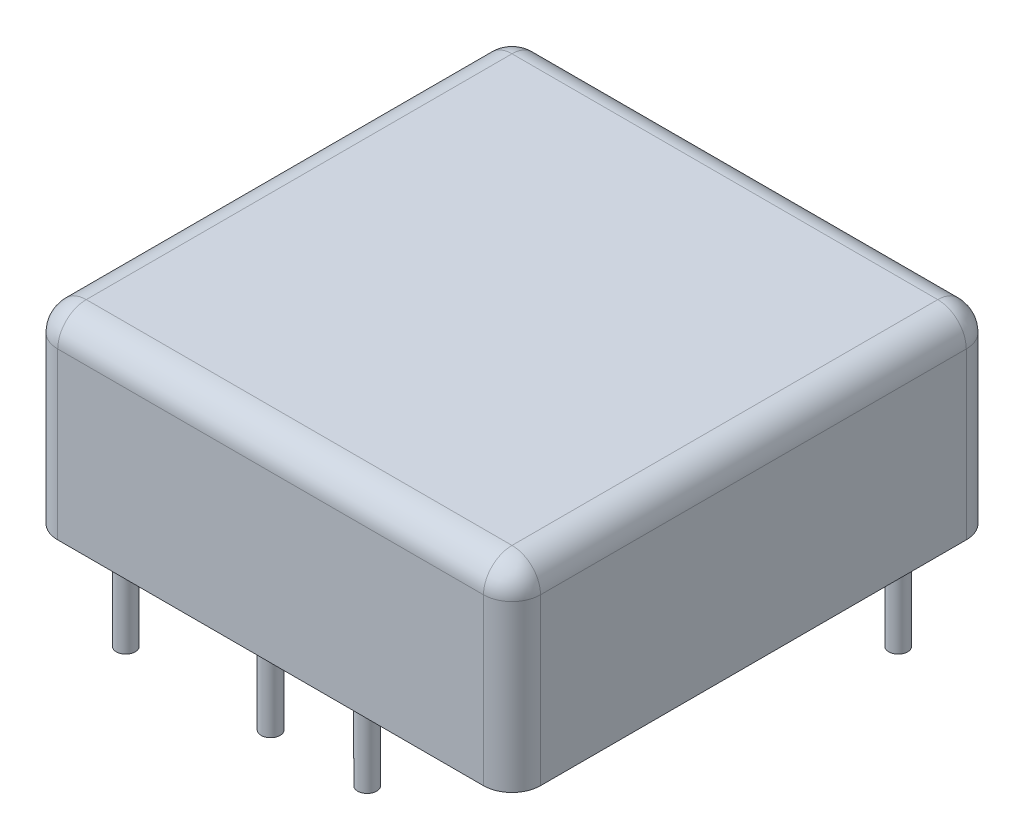
ISO-10303-21;
HEADER;
FILE_DESCRIPTION(('STEP AP214'),'2;1');
FILE_NAME('part.step','',(''),(''),'','','');
FILE_SCHEMA(('AUTOMOTIVE_DESIGN { 1 0 10303 214 1 1 1 1 }'));
ENDSEC;
DATA;
#1=APPLICATION_CONTEXT('core data for automotive mechanical design processes');
#2=APPLICATION_PROTOCOL_DEFINITION('international standard','automotive_design',2000,#1);
#3=PRODUCT_CONTEXT('',#1,'mechanical');
#4=PRODUCT('Part','Part','',(#3));
#5=PRODUCT_RELATED_PRODUCT_CATEGORY('part','',(#4));
#6=PRODUCT_DEFINITION_FORMATION('','',#4);
#7=PRODUCT_DEFINITION_CONTEXT('part definition',#1,'design');
#8=PRODUCT_DEFINITION('design','',#6,#7);
#9=PRODUCT_DEFINITION_SHAPE('','',#8);
#10=(LENGTH_UNIT() NAMED_UNIT(*) SI_UNIT(.MILLI.,.METRE.));
#11=(NAMED_UNIT(*) PLANE_ANGLE_UNIT() SI_UNIT($,.RADIAN.));
#12=(NAMED_UNIT(*) SI_UNIT($,.STERADIAN.) SOLID_ANGLE_UNIT());
#13=UNCERTAINTY_MEASURE_WITH_UNIT(LENGTH_MEASURE(1.E-05),#10,'distance_accuracy_value','');
#14=(GEOMETRIC_REPRESENTATION_CONTEXT(3) GLOBAL_UNCERTAINTY_ASSIGNED_CONTEXT((#13)) GLOBAL_UNIT_ASSIGNED_CONTEXT((#10,
#11,#12)) REPRESENTATION_CONTEXT('',''));
#15=CARTESIAN_POINT('',(0.,0.,0.));
#16=DIRECTION('',(0.,0.,1.));
#17=DIRECTION('',(1.,0.,0.));
#18=AXIS2_PLACEMENT_3D('',#15,#16,#17);
#19=CARTESIAN_POINT('',(-12.7,0.,12.7));
#20=DIRECTION('',(0.,1.,0.));
#21=DIRECTION('',(0.,0.,1.));
#22=AXIS2_PLACEMENT_3D('',#19,#20,#21);
#23=PLANE('',#22);
#24=DIRECTION('',(1.,0.,0.));
#25=VECTOR('',#24,1.);
#26=CARTESIAN_POINT('',(-4.2,0.,-4.));
#27=LINE('',#26,#25);
#28=CARTESIAN_POINT('',(-4.2,0.,-4.));
#29=VERTEX_POINT('',#28);
#30=CARTESIAN_POINT('',(4.2,0.,-4.));
#31=VERTEX_POINT('',#30);
#32=EDGE_CURVE('E35',#29,#31,#27,.T.);
#33=ORIENTED_EDGE('',*,*,#32,.F.);
#34=CARTESIAN_POINT('',(-4.2,0.,0.));
#35=DIRECTION('',(0.,-1.,0.));
#36=DIRECTION('',(0.,0.,-1.));
#37=AXIS2_PLACEMENT_3D('',#34,#35,#36);
#38=CIRCLE('',#37,4.);
#39=CARTESIAN_POINT('',(-4.2,0.,4.));
#40=VERTEX_POINT('',#39);
#41=EDGE_CURVE('E274',#40,#29,#38,.T.);
#42=ORIENTED_EDGE('',*,*,#41,.F.);
#43=DIRECTION('',(-1.,0.,0.));
#44=VECTOR('',#43,1.);
#45=CARTESIAN_POINT('',(-4.2,0.,4.));
#46=LINE('',#45,#44);
#47=CARTESIAN_POINT('',(4.2,0.,4.));
#48=VERTEX_POINT('',#47);
#49=EDGE_CURVE('E275',#48,#40,#46,.T.);
#50=ORIENTED_EDGE('',*,*,#49,.F.);
#51=CARTESIAN_POINT('',(4.2,0.,0.));
#52=DIRECTION('',(0.,-1.,0.));
#53=DIRECTION('',(0.,0.,-1.));
#54=AXIS2_PLACEMENT_3D('',#51,#52,#53);
#55=CIRCLE('',#54,4.);
#56=EDGE_CURVE('E135',#31,#48,#55,.T.);
#57=ORIENTED_EDGE('',*,*,#56,.F.);
#58=EDGE_LOOP('',(#33,#42,#50,#57));
#59=FACE_BOUND('',#58,.T.);
#60=DIRECTION('',(0.,0.,1.));
#61=VECTOR('',#60,1.);
#62=CARTESIAN_POINT('',(-12.7,0.,-12.7));
#63=LINE('',#62,#61);
#64=CARTESIAN_POINT('',(-12.7,0.,-11.2));
#65=VERTEX_POINT('',#64);
#66=CARTESIAN_POINT('',(-12.7,0.,11.2));
#67=VERTEX_POINT('',#66);
#68=EDGE_CURVE('E192',#65,#67,#63,.T.);
#69=ORIENTED_EDGE('',*,*,#68,.F.);
#70=CARTESIAN_POINT('',(-11.2,0.,-11.2));
#71=DIRECTION('',(0.,-1.,0.));
#72=DIRECTION('',(0.,0.,1.));
#73=AXIS2_PLACEMENT_3D('',#70,#71,#72);
#74=CIRCLE('',#73,1.5);
#75=CARTESIAN_POINT('',(-11.2,0.,-12.7));
#76=VERTEX_POINT('',#75);
#77=EDGE_CURVE('E11',#65,#76,#74,.T.);
#78=ORIENTED_EDGE('',*,*,#77,.T.);
#79=DIRECTION('',(-1.,0.,0.));
#80=VECTOR('',#79,1.);
#81=CARTESIAN_POINT('',(-12.7,0.,-12.7));
#82=LINE('',#81,#80);
#83=CARTESIAN_POINT('',(11.2,0.,-12.7));
#84=VERTEX_POINT('',#83);
#85=EDGE_CURVE('E228',#84,#76,#82,.T.);
#86=ORIENTED_EDGE('',*,*,#85,.F.);
#87=CARTESIAN_POINT('',(11.2,0.,-11.2));
#88=DIRECTION('',(0.,-1.,0.));
#89=DIRECTION('',(0.,0.,1.));
#90=AXIS2_PLACEMENT_3D('',#87,#88,#89);
#91=CIRCLE('',#90,1.5);
#92=CARTESIAN_POINT('',(12.7,0.,-11.2));
#93=VERTEX_POINT('',#92);
#94=EDGE_CURVE('E26',#84,#93,#91,.T.);
#95=ORIENTED_EDGE('',*,*,#94,.T.);
#96=DIRECTION('',(0.,0.,-1.));
#97=VECTOR('',#96,1.);
#98=CARTESIAN_POINT('',(12.7,0.,-12.7));
#99=LINE('',#98,#97);
#100=CARTESIAN_POINT('',(12.7,0.,11.2));
#101=VERTEX_POINT('',#100);
#102=EDGE_CURVE('E224',#101,#93,#99,.T.);
#103=ORIENTED_EDGE('',*,*,#102,.F.);
#104=CARTESIAN_POINT('',(11.2,0.,11.2));
#105=DIRECTION('',(0.,-1.,0.));
#106=DIRECTION('',(0.,0.,1.));
#107=AXIS2_PLACEMENT_3D('',#104,#105,#106);
#108=CIRCLE('',#107,1.5);
#109=CARTESIAN_POINT('',(11.2,0.,12.7));
#110=VERTEX_POINT('',#109);
#111=EDGE_CURVE('E201',#101,#110,#108,.T.);
#112=ORIENTED_EDGE('',*,*,#111,.T.);
#113=DIRECTION('',(1.,0.,0.));
#114=VECTOR('',#113,1.);
#115=CARTESIAN_POINT('',(-12.7,0.,12.7));
#116=LINE('',#115,#114);
#117=CARTESIAN_POINT('',(-11.2,0.,12.7));
#118=VERTEX_POINT('',#117);
#119=EDGE_CURVE('E214',#118,#110,#116,.T.);
#120=ORIENTED_EDGE('',*,*,#119,.F.);
#121=CARTESIAN_POINT('',(-11.2,0.,11.2));
#122=DIRECTION('',(0.,-1.,0.));
#123=DIRECTION('',(0.,0.,1.));
#124=AXIS2_PLACEMENT_3D('',#121,#122,#123);
#125=CIRCLE('',#124,1.5);
#126=EDGE_CURVE('E198',#118,#67,#125,.T.);
#127=ORIENTED_EDGE('',*,*,#126,.T.);
#128=EDGE_LOOP('',(#69,#78,#86,#95,#103,#112,#120,#127));
#129=FACE_BOUND('',#128,.T.);
#130=CARTESIAN_POINT('',(-10.16,0.,10.16));
#131=DIRECTION('',(0.,-1.,0.));
#132=DIRECTION('',(0.,0.,1.));
#133=AXIS2_PLACEMENT_3D('',#130,#131,#132);
#134=CIRCLE('',#133,0.5);
#135=CARTESIAN_POINT('',(-10.16,0.,10.66));
#136=VERTEX_POINT('',#135);
#137=EDGE_CURVE('E247',#136,#136,#134,.T.);
#138=ORIENTED_EDGE('',*,*,#137,.F.);
#139=EDGE_LOOP('',(#138));
#140=FACE_BOUND('',#139,.T.);
#141=CARTESIAN_POINT('',(-2.54000000000001,0.,10.16));
#142=DIRECTION('',(0.,-1.,0.));
#143=DIRECTION('',(0.,0.,1.));
#144=AXIS2_PLACEMENT_3D('',#141,#142,#143);
#145=CIRCLE('',#144,0.5);
#146=CARTESIAN_POINT('',(-2.54000000000001,0.,10.66));
#147=VERTEX_POINT('',#146);
#148=EDGE_CURVE('E251',#147,#147,#145,.T.);
#149=ORIENTED_EDGE('',*,*,#148,.F.);
#150=EDGE_LOOP('',(#149));
#151=FACE_BOUND('',#150,.T.);
#152=CARTESIAN_POINT('',(2.53999999999999,0.,10.16));
#153=DIRECTION('',(0.,-1.,0.));
#154=DIRECTION('',(0.,0.,1.));
#155=AXIS2_PLACEMENT_3D('',#152,#153,#154);
#156=CIRCLE('',#155,0.5);
#157=CARTESIAN_POINT('',(2.53999999999999,0.,10.66));
#158=VERTEX_POINT('',#157);
#159=EDGE_CURVE('E258',#158,#158,#156,.T.);
#160=ORIENTED_EDGE('',*,*,#159,.F.);
#161=EDGE_LOOP('',(#160));
#162=FACE_BOUND('',#161,.T.);
#163=CARTESIAN_POINT('',(-10.16,0.,-10.16));
#164=DIRECTION('',(0.,-1.,0.));
#165=DIRECTION('',(0.,0.,1.));
#166=AXIS2_PLACEMENT_3D('',#163,#164,#165);
#167=CIRCLE('',#166,0.5);
#168=CARTESIAN_POINT('',(-10.16,0.,-9.66));
#169=VERTEX_POINT('',#168);
#170=EDGE_CURVE('E262',#169,#169,#167,.T.);
#171=ORIENTED_EDGE('',*,*,#170,.F.);
#172=EDGE_LOOP('',(#171));
#173=FACE_BOUND('',#172,.T.);
#174=CARTESIAN_POINT('',(0.,0.,-10.16));
#175=DIRECTION('',(0.,-1.,0.));
#176=DIRECTION('',(0.,0.,1.));
#177=AXIS2_PLACEMENT_3D('',#174,#175,#176);
#178=CIRCLE('',#177,0.5);
#179=CARTESIAN_POINT('',(0.,0.,-9.66));
#180=VERTEX_POINT('',#179);
#181=EDGE_CURVE('E266',#180,#180,#178,.T.);
#182=ORIENTED_EDGE('',*,*,#181,.F.);
#183=EDGE_LOOP('',(#182));
#184=FACE_BOUND('',#183,.T.);
#185=CARTESIAN_POINT('',(10.16,0.,-10.16));
#186=DIRECTION('',(0.,-1.,0.));
#187=DIRECTION('',(0.,0.,1.));
#188=AXIS2_PLACEMENT_3D('',#185,#186,#187);
#189=CIRCLE('',#188,0.5);
#190=CARTESIAN_POINT('',(10.16,0.,-9.66000000000001));
#191=VERTEX_POINT('',#190);
#192=EDGE_CURVE('E204',#191,#191,#189,.T.);
#193=ORIENTED_EDGE('',*,*,#192,.F.);
#194=EDGE_LOOP('',(#193));
#195=FACE_BOUND('',#194,.T.);
#196=ADVANCED_FACE('F16',(#59,#129,#140,#151,#162,#173,#184,#195),#23,.F.);
#197=CARTESIAN_POINT('',(-12.7,10.2,-12.7));
#198=DIRECTION('',(1.,0.,0.));
#199=DIRECTION('',(0.,0.,-1.));
#200=AXIS2_PLACEMENT_3D('',#197,#198,#199);
#201=PLANE('',#200);
#202=DIRECTION('',(0.,0.,-1.));
#203=VECTOR('',#202,1.);
#204=CARTESIAN_POINT('',(-12.7,8.7,-12.7));
#205=LINE('',#204,#203);
#206=CARTESIAN_POINT('',(-12.7,8.7,11.2));
#207=VERTEX_POINT('',#206);
#208=CARTESIAN_POINT('',(-12.7,8.7,-11.2));
#209=VERTEX_POINT('',#208);
#210=EDGE_CURVE('E181',#207,#209,#205,.T.);
#211=ORIENTED_EDGE('',*,*,#210,.T.);
#212=DIRECTION('',(0.,-1.,0.));
#213=VECTOR('',#212,1.);
#214=CARTESIAN_POINT('',(-12.7,10.2,-11.2));
#215=LINE('',#214,#213);
#216=EDGE_CURVE('E189',#209,#65,#215,.T.);
#217=ORIENTED_EDGE('',*,*,#216,.T.);
#218=ORIENTED_EDGE('',*,*,#68,.T.);
#219=DIRECTION('',(0.,1.,0.));
#220=VECTOR('',#219,1.);
#221=CARTESIAN_POINT('',(-12.7,10.2,11.2));
#222=LINE('',#221,#220);
#223=EDGE_CURVE('E197',#67,#207,#222,.T.);
#224=ORIENTED_EDGE('',*,*,#223,.T.);
#225=EDGE_LOOP('',(#211,#217,#218,#224));
#226=FACE_BOUND('',#225,.T.);
#227=ADVANCED_FACE('F195',(#226),#201,.F.);
#228=CARTESIAN_POINT('',(-12.7,10.2,12.7));
#229=DIRECTION('',(0.,0.,-1.));
#230=DIRECTION('',(-1.,0.,0.));
#231=AXIS2_PLACEMENT_3D('',#228,#229,#230);
#232=PLANE('',#231);
#233=DIRECTION('',(-1.,0.,0.));
#234=VECTOR('',#233,1.);
#235=CARTESIAN_POINT('',(-12.7,8.7,12.7));
#236=LINE('',#235,#234);
#237=CARTESIAN_POINT('',(11.2,8.7,12.7));
#238=VERTEX_POINT('',#237);
#239=CARTESIAN_POINT('',(-11.2,8.7,12.7));
#240=VERTEX_POINT('',#239);
#241=EDGE_CURVE('E208',#238,#240,#236,.T.);
#242=ORIENTED_EDGE('',*,*,#241,.T.);
#243=DIRECTION('',(0.,-1.,0.));
#244=VECTOR('',#243,1.);
#245=CARTESIAN_POINT('',(-11.2,10.2,12.7));
#246=LINE('',#245,#244);
#247=EDGE_CURVE('E211',#240,#118,#246,.T.);
#248=ORIENTED_EDGE('',*,*,#247,.T.);
#249=ORIENTED_EDGE('',*,*,#119,.T.);
#250=DIRECTION('',(0.,1.,0.));
#251=VECTOR('',#250,1.);
#252=CARTESIAN_POINT('',(11.2,10.2,12.7));
#253=LINE('',#252,#251);
#254=EDGE_CURVE('E215',#110,#238,#253,.T.);
#255=ORIENTED_EDGE('',*,*,#254,.T.);
#256=EDGE_LOOP('',(#242,#248,#249,#255));
#257=FACE_BOUND('',#256,.T.);
#258=ADVANCED_FACE('F620',(#257),#232,.F.);
#259=CARTESIAN_POINT('',(12.7,10.2,-12.7));
#260=DIRECTION('',(-1.,0.,0.));
#261=DIRECTION('',(0.,0.,1.));
#262=AXIS2_PLACEMENT_3D('',#259,#260,#261);
#263=PLANE('',#262);
#264=DIRECTION('',(0.,0.,1.));
#265=VECTOR('',#264,1.);
#266=CARTESIAN_POINT('',(12.7,8.7,12.7));
#267=LINE('',#266,#265);
#268=CARTESIAN_POINT('',(12.7,8.7,-11.2));
#269=VERTEX_POINT('',#268);
#270=CARTESIAN_POINT('',(12.7,8.7,11.2));
#271=VERTEX_POINT('',#270);
#272=EDGE_CURVE('E218',#269,#271,#267,.T.);
#273=ORIENTED_EDGE('',*,*,#272,.T.);
#274=DIRECTION('',(0.,-1.,0.));
#275=VECTOR('',#274,1.);
#276=CARTESIAN_POINT('',(12.7,10.2,11.2));
#277=LINE('',#276,#275);
#278=EDGE_CURVE('E221',#271,#101,#277,.T.);
#279=ORIENTED_EDGE('',*,*,#278,.T.);
#280=ORIENTED_EDGE('',*,*,#102,.T.);
#281=DIRECTION('',(0.,1.,0.));
#282=VECTOR('',#281,1.);
#283=CARTESIAN_POINT('',(12.7,10.2,-11.2));
#284=LINE('',#283,#282);
#285=EDGE_CURVE('E225',#93,#269,#284,.T.);
#286=ORIENTED_EDGE('',*,*,#285,.T.);
#287=EDGE_LOOP('',(#273,#279,#280,#286));
#288=FACE_BOUND('',#287,.T.);
#289=ADVANCED_FACE('F611',(#288),#263,.F.);
#290=CARTESIAN_POINT('',(-12.7,10.2,-12.7));
#291=DIRECTION('',(0.,0.,1.));
#292=DIRECTION('',(1.,0.,0.));
#293=AXIS2_PLACEMENT_3D('',#290,#291,#292);
#294=PLANE('',#293);
#295=ORIENTED_EDGE('',*,*,#85,.T.);
#296=DIRECTION('',(0.,1.,0.));
#297=VECTOR('',#296,1.);
#298=CARTESIAN_POINT('',(-11.2,10.2,-12.7));
#299=LINE('',#298,#297);
#300=CARTESIAN_POINT('',(-11.2,8.7,-12.7));
#301=VERTEX_POINT('',#300);
#302=EDGE_CURVE('E229',#76,#301,#299,.T.);
#303=ORIENTED_EDGE('',*,*,#302,.T.);
#304=DIRECTION('',(1.,0.,0.));
#305=VECTOR('',#304,1.);
#306=CARTESIAN_POINT('',(12.7,8.7,-12.7));
#307=LINE('',#306,#305);
#308=CARTESIAN_POINT('',(11.2,8.7,-12.7));
#309=VERTEX_POINT('',#308);
#310=EDGE_CURVE('E232',#301,#309,#307,.T.);
#311=ORIENTED_EDGE('',*,*,#310,.T.);
#312=DIRECTION('',(0.,-1.,0.));
#313=VECTOR('',#312,1.);
#314=CARTESIAN_POINT('',(11.2,10.2,-12.7));
#315=LINE('',#314,#313);
#316=EDGE_CURVE('E235',#309,#84,#315,.T.);
#317=ORIENTED_EDGE('',*,*,#316,.T.);
#318=EDGE_LOOP('',(#295,#303,#311,#317));
#319=FACE_BOUND('',#318,.T.);
#320=ADVANCED_FACE('F603',(#319),#294,.F.);
#321=CARTESIAN_POINT('',(-12.7,10.2,12.7));
#322=DIRECTION('',(0.,1.,0.));
#323=DIRECTION('',(0.,0.,1.));
#324=AXIS2_PLACEMENT_3D('',#321,#322,#323);
#325=PLANE('',#324);
#326=DIRECTION('',(1.,0.,0.));
#327=VECTOR('',#326,1.);
#328=CARTESIAN_POINT('',(12.7,10.2,11.2));
#329=LINE('',#328,#327);
#330=CARTESIAN_POINT('',(-11.2,10.2,11.2));
#331=VERTEX_POINT('',#330);
#332=CARTESIAN_POINT('',(11.2,10.2,11.2));
#333=VERTEX_POINT('',#332);
#334=EDGE_CURVE('E238',#331,#333,#329,.T.);
#335=ORIENTED_EDGE('',*,*,#334,.T.);
#336=DIRECTION('',(0.,0.,-1.));
#337=VECTOR('',#336,1.);
#338=CARTESIAN_POINT('',(11.2,10.2,-12.7));
#339=LINE('',#338,#337);
#340=CARTESIAN_POINT('',(11.2,10.2,-11.2));
#341=VERTEX_POINT('',#340);
#342=EDGE_CURVE('E241',#333,#341,#339,.T.);
#343=ORIENTED_EDGE('',*,*,#342,.T.);
#344=DIRECTION('',(-1.,0.,0.));
#345=VECTOR('',#344,1.);
#346=CARTESIAN_POINT('',(-12.7,10.2,-11.2));
#347=LINE('',#346,#345);
#348=CARTESIAN_POINT('',(-11.2,10.2,-11.2));
#349=VERTEX_POINT('',#348);
#350=EDGE_CURVE('E244',#341,#349,#347,.T.);
#351=ORIENTED_EDGE('',*,*,#350,.T.);
#352=DIRECTION('',(0.,0.,1.));
#353=VECTOR('',#352,1.);
#354=CARTESIAN_POINT('',(-11.2,10.2,12.7));
#355=LINE('',#354,#353);
#356=EDGE_CURVE('E184',#349,#331,#355,.T.);
#357=ORIENTED_EDGE('',*,*,#356,.T.);
#358=EDGE_LOOP('',(#335,#343,#351,#357));
#359=FACE_BOUND('',#358,.T.);
#360=ADVANCED_FACE('F593',(#359),#325,.T.);
#361=CARTESIAN_POINT('',(-10.16,-5.6,10.16));
#362=DIRECTION('',(0.,1.,0.));
#363=DIRECTION('',(0.,0.,1.));
#364=AXIS2_PLACEMENT_3D('',#361,#362,#363);
#365=CYLINDRICAL_SURFACE('',#364,0.5);
#366=CARTESIAN_POINT('',(-10.16,-5.6,10.16));
#367=DIRECTION('',(0.,-1.,0.));
#368=DIRECTION('',(0.,0.,-1.));
#369=AXIS2_PLACEMENT_3D('',#366,#367,#368);
#370=CIRCLE('',#369,0.5);
#371=CARTESIAN_POINT('',(-10.16,-5.6,9.66));
#372=VERTEX_POINT('',#371);
#373=EDGE_CURVE('E248',#372,#372,#370,.T.);
#374=ORIENTED_EDGE('',*,*,#373,.F.);
#375=EDGE_LOOP('',(#374));
#376=FACE_BOUND('',#375,.T.);
#377=ORIENTED_EDGE('',*,*,#137,.T.);
#378=EDGE_LOOP('',(#377));
#379=FACE_BOUND('',#378,.T.);
#380=ADVANCED_FACE('F583',(#376,#379),#365,.T.);
#381=CARTESIAN_POINT('',(-10.16,-5.6,10.16));
#382=DIRECTION('',(0.,-1.,0.));
#383=DIRECTION('',(0.,0.,-1.));
#384=AXIS2_PLACEMENT_3D('',#381,#382,#383);
#385=PLANE('',#384);
#386=ORIENTED_EDGE('',*,*,#373,.T.);
#387=EDGE_LOOP('',(#386));
#388=FACE_BOUND('',#387,.T.);
#389=ADVANCED_FACE('F573',(#388),#385,.T.);
#390=CARTESIAN_POINT('',(-2.54000000000001,-5.6,10.16));
#391=DIRECTION('',(0.,1.,0.));
#392=DIRECTION('',(0.,0.,1.));
#393=AXIS2_PLACEMENT_3D('',#390,#391,#392);
#394=CYLINDRICAL_SURFACE('',#393,0.5);
#395=CARTESIAN_POINT('',(-2.54000000000001,-5.6,10.16));
#396=DIRECTION('',(0.,-1.,0.));
#397=DIRECTION('',(0.,0.,-1.));
#398=AXIS2_PLACEMENT_3D('',#395,#396,#397);
#399=CIRCLE('',#398,0.5);
#400=CARTESIAN_POINT('',(-2.54000000000001,-5.6,9.66));
#401=VERTEX_POINT('',#400);
#402=EDGE_CURVE('E252',#401,#401,#399,.T.);
#403=ORIENTED_EDGE('',*,*,#402,.F.);
#404=EDGE_LOOP('',(#403));
#405=FACE_BOUND('',#404,.T.);
#406=ORIENTED_EDGE('',*,*,#148,.T.);
#407=EDGE_LOOP('',(#406));
#408=FACE_BOUND('',#407,.T.);
#409=ADVANCED_FACE('F563',(#405,#408),#394,.T.);
#410=CARTESIAN_POINT('',(-2.54000000000001,-5.6,10.16));
#411=DIRECTION('',(0.,-1.,0.));
#412=DIRECTION('',(0.,0.,-1.));
#413=AXIS2_PLACEMENT_3D('',#410,#411,#412);
#414=PLANE('',#413);
#415=ORIENTED_EDGE('',*,*,#402,.T.);
#416=EDGE_LOOP('',(#415));
#417=FACE_BOUND('',#416,.T.);
#418=ADVANCED_FACE('F553',(#417),#414,.T.);
#419=CARTESIAN_POINT('',(2.53999999999999,-5.6,10.16));
#420=DIRECTION('',(0.,-1.,0.));
#421=DIRECTION('',(0.,0.,-1.));
#422=AXIS2_PLACEMENT_3D('',#419,#420,#421);
#423=PLANE('',#422);
#424=CARTESIAN_POINT('',(2.53999999999999,-5.6,10.16));
#425=DIRECTION('',(0.,-1.,0.));
#426=DIRECTION('',(0.,0.,-1.));
#427=AXIS2_PLACEMENT_3D('',#424,#425,#426);
#428=CIRCLE('',#427,0.5);
#429=CARTESIAN_POINT('',(2.53999999999999,-5.6,9.66));
#430=VERTEX_POINT('',#429);
#431=EDGE_CURVE('E255',#430,#430,#428,.T.);
#432=ORIENTED_EDGE('',*,*,#431,.T.);
#433=EDGE_LOOP('',(#432));
#434=FACE_BOUND('',#433,.T.);
#435=ADVANCED_FACE('F543',(#434),#423,.T.);
#436=CARTESIAN_POINT('',(2.53999999999999,-5.6,10.16));
#437=DIRECTION('',(0.,1.,0.));
#438=DIRECTION('',(0.,0.,1.));
#439=AXIS2_PLACEMENT_3D('',#436,#437,#438);
#440=CYLINDRICAL_SURFACE('',#439,0.5);
#441=ORIENTED_EDGE('',*,*,#431,.F.);
#442=EDGE_LOOP('',(#441));
#443=FACE_BOUND('',#442,.T.);
#444=ORIENTED_EDGE('',*,*,#159,.T.);
#445=EDGE_LOOP('',(#444));
#446=FACE_BOUND('',#445,.T.);
#447=ADVANCED_FACE('F533',(#443,#446),#440,.T.);
#448=CARTESIAN_POINT('',(-10.16,-5.6,-10.16));
#449=DIRECTION('',(0.,-1.,0.));
#450=DIRECTION('',(0.,0.,-1.));
#451=AXIS2_PLACEMENT_3D('',#448,#449,#450);
#452=PLANE('',#451);
#453=CARTESIAN_POINT('',(-10.16,-5.6,-10.16));
#454=DIRECTION('',(0.,-1.,0.));
#455=DIRECTION('',(0.,0.,-1.));
#456=AXIS2_PLACEMENT_3D('',#453,#454,#455);
#457=CIRCLE('',#456,0.5);
#458=CARTESIAN_POINT('',(-10.16,-5.6,-10.66));
#459=VERTEX_POINT('',#458);
#460=EDGE_CURVE('E259',#459,#459,#457,.T.);
#461=ORIENTED_EDGE('',*,*,#460,.T.);
#462=EDGE_LOOP('',(#461));
#463=FACE_BOUND('',#462,.T.);
#464=ADVANCED_FACE('F523',(#463),#452,.T.);
#465=CARTESIAN_POINT('',(-10.16,-5.6,-10.16));
#466=DIRECTION('',(0.,1.,0.));
#467=DIRECTION('',(0.,0.,1.));
#468=AXIS2_PLACEMENT_3D('',#465,#466,#467);
#469=CYLINDRICAL_SURFACE('',#468,0.5);
#470=ORIENTED_EDGE('',*,*,#460,.F.);
#471=EDGE_LOOP('',(#470));
#472=FACE_BOUND('',#471,.T.);
#473=ORIENTED_EDGE('',*,*,#170,.T.);
#474=EDGE_LOOP('',(#473));
#475=FACE_BOUND('',#474,.T.);
#476=ADVANCED_FACE('F513',(#472,#475),#469,.T.);
#477=CARTESIAN_POINT('',(0.,-5.6,-10.16));
#478=DIRECTION('',(0.,-1.,0.));
#479=DIRECTION('',(0.,0.,-1.));
#480=AXIS2_PLACEMENT_3D('',#477,#478,#479);
#481=PLANE('',#480);
#482=CARTESIAN_POINT('',(0.,-5.6,-10.16));
#483=DIRECTION('',(0.,-1.,0.));
#484=DIRECTION('',(0.,0.,-1.));
#485=AXIS2_PLACEMENT_3D('',#482,#483,#484);
#486=CIRCLE('',#485,0.5);
#487=CARTESIAN_POINT('',(0.,-5.6,-10.66));
#488=VERTEX_POINT('',#487);
#489=EDGE_CURVE('E263',#488,#488,#486,.T.);
#490=ORIENTED_EDGE('',*,*,#489,.T.);
#491=EDGE_LOOP('',(#490));
#492=FACE_BOUND('',#491,.T.);
#493=ADVANCED_FACE('F503',(#492),#481,.T.);
#494=CARTESIAN_POINT('',(0.,-5.6,-10.16));
#495=DIRECTION('',(0.,1.,0.));
#496=DIRECTION('',(0.,0.,1.));
#497=AXIS2_PLACEMENT_3D('',#494,#495,#496);
#498=CYLINDRICAL_SURFACE('',#497,0.5);
#499=ORIENTED_EDGE('',*,*,#489,.F.);
#500=EDGE_LOOP('',(#499));
#501=FACE_BOUND('',#500,.T.);
#502=ORIENTED_EDGE('',*,*,#181,.T.);
#503=EDGE_LOOP('',(#502));
#504=FACE_BOUND('',#503,.T.);
#505=ADVANCED_FACE('F300',(#501,#504),#498,.T.);
#506=CARTESIAN_POINT('',(10.16,-5.6,-10.16));
#507=DIRECTION('',(0.,-1.,0.));
#508=DIRECTION('',(0.,0.,-1.));
#509=AXIS2_PLACEMENT_3D('',#506,#507,#508);
#510=PLANE('',#509);
#511=CARTESIAN_POINT('',(10.16,-5.6,-10.16));
#512=DIRECTION('',(0.,-1.,0.));
#513=DIRECTION('',(0.,0.,-1.));
#514=AXIS2_PLACEMENT_3D('',#511,#512,#513);
#515=CIRCLE('',#514,0.5);
#516=CARTESIAN_POINT('',(10.16,-5.6,-10.66));
#517=VERTEX_POINT('',#516);
#518=EDGE_CURVE('E267',#517,#517,#515,.T.);
#519=ORIENTED_EDGE('',*,*,#518,.T.);
#520=EDGE_LOOP('',(#519));
#521=FACE_BOUND('',#520,.T.);
#522=ADVANCED_FACE('F484',(#521),#510,.T.);
#523=CARTESIAN_POINT('',(10.16,-5.6,-10.16));
#524=DIRECTION('',(0.,1.,0.));
#525=DIRECTION('',(0.,0.,1.));
#526=AXIS2_PLACEMENT_3D('',#523,#524,#525);
#527=CYLINDRICAL_SURFACE('',#526,0.5);
#528=ORIENTED_EDGE('',*,*,#518,.F.);
#529=EDGE_LOOP('',(#528));
#530=FACE_BOUND('',#529,.T.);
#531=ORIENTED_EDGE('',*,*,#192,.T.);
#532=EDGE_LOOP('',(#531));
#533=FACE_BOUND('',#532,.T.);
#534=ADVANCED_FACE('F321',(#530,#533),#527,.T.);
#535=CARTESIAN_POINT('',(-4.2,0.1,0.));
#536=DIRECTION('',(0.,-1.,0.));
#537=DIRECTION('',(0.,0.,-1.));
#538=AXIS2_PLACEMENT_3D('',#535,#536,#537);
#539=CYLINDRICAL_SURFACE('',#538,4.);
#540=ORIENTED_EDGE('',*,*,#41,.T.);
#541=DIRECTION('',(0.,-1.,0.));
#542=VECTOR('',#541,1.);
#543=CARTESIAN_POINT('',(-4.2,0.1,-4.));
#544=LINE('',#543,#542);
#545=CARTESIAN_POINT('',(-4.2,0.1,-4.));
#546=VERTEX_POINT('',#545);
#547=EDGE_CURVE('E141',#546,#29,#544,.T.);
#548=ORIENTED_EDGE('',*,*,#547,.F.);
#549=CARTESIAN_POINT('',(-4.2,0.1,0.));
#550=DIRECTION('',(0.,-1.,0.));
#551=DIRECTION('',(0.,0.,-1.));
#552=AXIS2_PLACEMENT_3D('',#549,#550,#551);
#553=CIRCLE('',#552,4.);
#554=CARTESIAN_POINT('',(-4.2,0.1,4.));
#555=VERTEX_POINT('',#554);
#556=EDGE_CURVE('E138',#555,#546,#553,.T.);
#557=ORIENTED_EDGE('',*,*,#556,.F.);
#558=DIRECTION('',(0.,-1.,0.));
#559=VECTOR('',#558,1.);
#560=CARTESIAN_POINT('',(-4.2,0.1,4.));
#561=LINE('',#560,#559);
#562=EDGE_CURVE('E271',#555,#40,#561,.T.);
#563=ORIENTED_EDGE('',*,*,#562,.T.);
#564=EDGE_LOOP('',(#540,#548,#557,#563));
#565=FACE_BOUND('',#564,.T.);
#566=ADVANCED_FACE('F310',(#565),#539,.F.);
#567=CARTESIAN_POINT('',(-4.2,0.1,4.));
#568=DIRECTION('',(0.,0.,1.));
#569=DIRECTION('',(1.,0.,0.));
#570=AXIS2_PLACEMENT_3D('',#567,#568,#569);
#571=PLANE('',#570);
#572=ORIENTED_EDGE('',*,*,#49,.T.);
#573=ORIENTED_EDGE('',*,*,#562,.F.);
#574=DIRECTION('',(-1.,0.,0.));
#575=VECTOR('',#574,1.);
#576=CARTESIAN_POINT('',(-4.2,0.1,4.));
#577=LINE('',#576,#575);
#578=CARTESIAN_POINT('',(4.2,0.1,4.));
#579=VERTEX_POINT('',#578);
#580=EDGE_CURVE('E116',#579,#555,#577,.T.);
#581=ORIENTED_EDGE('',*,*,#580,.F.);
#582=DIRECTION('',(0.,-1.,0.));
#583=VECTOR('',#582,1.);
#584=CARTESIAN_POINT('',(4.2,0.1,4.));
#585=LINE('',#584,#583);
#586=EDGE_CURVE('E126',#579,#48,#585,.T.);
#587=ORIENTED_EDGE('',*,*,#586,.T.);
#588=EDGE_LOOP('',(#572,#573,#581,#587));
#589=FACE_BOUND('',#588,.T.);
#590=ADVANCED_FACE('F312',(#589),#571,.F.);
#591=CARTESIAN_POINT('',(4.2,0.1,0.));
#592=DIRECTION('',(0.,-1.,0.));
#593=DIRECTION('',(0.,0.,-1.));
#594=AXIS2_PLACEMENT_3D('',#591,#592,#593);
#595=CYLINDRICAL_SURFACE('',#594,4.);
#596=ORIENTED_EDGE('',*,*,#56,.T.);
#597=ORIENTED_EDGE('',*,*,#586,.F.);
#598=CARTESIAN_POINT('',(4.2,0.1,0.));
#599=DIRECTION('',(0.,-1.,0.));
#600=DIRECTION('',(0.,0.,-1.));
#601=AXIS2_PLACEMENT_3D('',#598,#599,#600);
#602=CIRCLE('',#601,4.);
#603=CARTESIAN_POINT('',(4.2,0.1,-4.));
#604=VERTEX_POINT('',#603);
#605=EDGE_CURVE('E122',#604,#579,#602,.T.);
#606=ORIENTED_EDGE('',*,*,#605,.F.);
#607=DIRECTION('',(0.,-1.,0.));
#608=VECTOR('',#607,1.);
#609=CARTESIAN_POINT('',(4.2,0.1,-4.));
#610=LINE('',#609,#608);
#611=EDGE_CURVE('E125',#604,#31,#610,.T.);
#612=ORIENTED_EDGE('',*,*,#611,.T.);
#613=EDGE_LOOP('',(#596,#597,#606,#612));
#614=FACE_BOUND('',#613,.T.);
#615=ADVANCED_FACE('F124',(#614),#595,.F.);
#616=CARTESIAN_POINT('',(-4.2,0.1,-4.));
#617=DIRECTION('',(0.,0.,-1.));
#618=DIRECTION('',(-1.,0.,0.));
#619=AXIS2_PLACEMENT_3D('',#616,#617,#618);
#620=PLANE('',#619);
#621=ORIENTED_EDGE('',*,*,#32,.T.);
#622=ORIENTED_EDGE('',*,*,#611,.F.);
#623=DIRECTION('',(1.,0.,0.));
#624=VECTOR('',#623,1.);
#625=CARTESIAN_POINT('',(-4.2,0.1,-4.));
#626=LINE('',#625,#624);
#627=EDGE_CURVE('E129',#546,#604,#626,.T.);
#628=ORIENTED_EDGE('',*,*,#627,.F.);
#629=ORIENTED_EDGE('',*,*,#547,.T.);
#630=EDGE_LOOP('',(#621,#622,#628,#629));
#631=FACE_BOUND('',#630,.T.);
#632=ADVANCED_FACE('F133',(#631),#620,.F.);
#633=CARTESIAN_POINT('',(-4.2,0.1,0.));
#634=DIRECTION('',(0.,-1.,0.));
#635=DIRECTION('',(0.,0.,-1.));
#636=AXIS2_PLACEMENT_3D('',#633,#634,#635);
#637=PLANE('',#636);
#638=ORIENTED_EDGE('',*,*,#556,.T.);
#639=ORIENTED_EDGE('',*,*,#627,.T.);
#640=ORIENTED_EDGE('',*,*,#605,.T.);
#641=ORIENTED_EDGE('',*,*,#580,.T.);
#642=EDGE_LOOP('',(#638,#639,#640,#641));
#643=FACE_BOUND('',#642,.T.);
#644=ADVANCED_FACE('F137',(#643),#637,.T.);
#645=CARTESIAN_POINT('',(11.2,10.2,11.2));
#646=DIRECTION('',(0.,-1.,0.));
#647=DIRECTION('',(0.,0.,-1.));
#648=AXIS2_PLACEMENT_3D('',#645,#646,#647);
#649=CYLINDRICAL_SURFACE('',#648,1.5);
#650=CARTESIAN_POINT('',(11.2,8.7,11.2));
#651=DIRECTION('',(0.,1.,0.));
#652=DIRECTION('',(0.,0.,1.));
#653=AXIS2_PLACEMENT_3D('',#650,#651,#652);
#654=CIRCLE('',#653,1.5);
#655=EDGE_CURVE('E144',#238,#271,#654,.T.);
#656=ORIENTED_EDGE('',*,*,#655,.F.);
#657=ORIENTED_EDGE('',*,*,#254,.F.);
#658=ORIENTED_EDGE('',*,*,#111,.F.);
#659=ORIENTED_EDGE('',*,*,#278,.F.);
#660=EDGE_LOOP('',(#656,#657,#658,#659));
#661=FACE_BOUND('',#660,.T.);
#662=ADVANCED_FACE('F329',(#661),#649,.T.);
#663=CARTESIAN_POINT('',(11.2,8.7,11.2));
#664=DIRECTION('',(0.,1.,0.));
#665=DIRECTION('',(1.,0.,0.));
#666=AXIS2_PLACEMENT_3D('',#663,#664,#665);
#667=SPHERICAL_SURFACE('',#666,1.5);
#668=CARTESIAN_POINT('',(11.2,8.7,11.2));
#669=DIRECTION('',(-1.,0.,0.));
#670=DIRECTION('',(0.,0.,-1.));
#671=AXIS2_PLACEMENT_3D('',#668,#669,#670);
#672=CIRCLE('',#671,1.5);
#673=EDGE_CURVE('E147',#238,#333,#672,.T.);
#674=ORIENTED_EDGE('',*,*,#673,.F.);
#675=ORIENTED_EDGE('',*,*,#655,.T.);
#676=CARTESIAN_POINT('',(11.2,8.7,11.2));
#677=DIRECTION('',(0.,0.,-1.));
#678=DIRECTION('',(0.,-1.,0.));
#679=AXIS2_PLACEMENT_3D('',#676,#677,#678);
#680=CIRCLE('',#679,1.5);
#681=EDGE_CURVE('E146',#333,#271,#680,.T.);
#682=ORIENTED_EDGE('',*,*,#681,.F.);
#683=EDGE_LOOP('',(#674,#675,#682));
#684=FACE_BOUND('',#683,.T.);
#685=ADVANCED_FACE('F332',(#684),#667,.T.);
#686=CARTESIAN_POINT('',(11.2,10.2,-11.2));
#687=DIRECTION('',(0.,-1.,0.));
#688=DIRECTION('',(0.,0.,-1.));
#689=AXIS2_PLACEMENT_3D('',#686,#687,#688);
#690=CYLINDRICAL_SURFACE('',#689,1.5);
#691=ORIENTED_EDGE('',*,*,#94,.F.);
#692=ORIENTED_EDGE('',*,*,#316,.F.);
#693=CARTESIAN_POINT('',(11.2,8.7,-11.2));
#694=DIRECTION('',(0.,1.,0.));
#695=DIRECTION('',(0.,0.,1.));
#696=AXIS2_PLACEMENT_3D('',#693,#694,#695);
#697=CIRCLE('',#696,1.5);
#698=EDGE_CURVE('E152',#269,#309,#697,.T.);
#699=ORIENTED_EDGE('',*,*,#698,.F.);
#700=ORIENTED_EDGE('',*,*,#285,.F.);
#701=EDGE_LOOP('',(#691,#692,#699,#700));
#702=FACE_BOUND('',#701,.T.);
#703=ADVANCED_FACE('F336',(#702),#690,.T.);
#704=CARTESIAN_POINT('',(11.2,8.7,12.7));
#705=DIRECTION('',(0.,0.,1.));
#706=DIRECTION('',(1.,0.,0.));
#707=AXIS2_PLACEMENT_3D('',#704,#705,#706);
#708=CYLINDRICAL_SURFACE('',#707,1.5);
#709=ORIENTED_EDGE('',*,*,#681,.T.);
#710=ORIENTED_EDGE('',*,*,#272,.F.);
#711=CARTESIAN_POINT('',(11.2,8.7,-11.2));
#712=DIRECTION('',(0.,0.,-1.));
#713=DIRECTION('',(-1.,0.,0.));
#714=AXIS2_PLACEMENT_3D('',#711,#712,#713);
#715=CIRCLE('',#714,1.5);
#716=EDGE_CURVE('E149',#341,#269,#715,.T.);
#717=ORIENTED_EDGE('',*,*,#716,.F.);
#718=ORIENTED_EDGE('',*,*,#342,.F.);
#719=EDGE_LOOP('',(#709,#710,#717,#718));
#720=FACE_BOUND('',#719,.T.);
#721=ADVANCED_FACE('F340',(#720),#708,.T.);
#722=CARTESIAN_POINT('',(-12.7,8.7,11.2));
#723=DIRECTION('',(-1.,0.,0.));
#724=DIRECTION('',(0.,0.,1.));
#725=AXIS2_PLACEMENT_3D('',#722,#723,#724);
#726=CYLINDRICAL_SURFACE('',#725,1.5);
#727=ORIENTED_EDGE('',*,*,#673,.T.);
#728=ORIENTED_EDGE('',*,*,#334,.F.);
#729=CARTESIAN_POINT('',(-11.2,8.7,11.2));
#730=DIRECTION('',(-1.,0.,0.));
#731=DIRECTION('',(0.,0.,1.));
#732=AXIS2_PLACEMENT_3D('',#729,#730,#731);
#733=CIRCLE('',#732,1.5);
#734=EDGE_CURVE('E157',#240,#331,#733,.T.);
#735=ORIENTED_EDGE('',*,*,#734,.F.);
#736=ORIENTED_EDGE('',*,*,#241,.F.);
#737=EDGE_LOOP('',(#727,#728,#735,#736));
#738=FACE_BOUND('',#737,.T.);
#739=ADVANCED_FACE('F344',(#738),#726,.T.);
#740=CARTESIAN_POINT('',(-11.2,10.2,11.2));
#741=DIRECTION('',(0.,-1.,0.));
#742=DIRECTION('',(0.,0.,-1.));
#743=AXIS2_PLACEMENT_3D('',#740,#741,#742);
#744=CYLINDRICAL_SURFACE('',#743,1.5);
#745=ORIENTED_EDGE('',*,*,#126,.F.);
#746=ORIENTED_EDGE('',*,*,#247,.F.);
#747=CARTESIAN_POINT('',(-11.2,8.7,11.2));
#748=DIRECTION('',(0.,1.,0.));
#749=DIRECTION('',(0.,0.,1.));
#750=AXIS2_PLACEMENT_3D('',#747,#748,#749);
#751=CIRCLE('',#750,1.5);
#752=EDGE_CURVE('E154',#207,#240,#751,.T.);
#753=ORIENTED_EDGE('',*,*,#752,.F.);
#754=ORIENTED_EDGE('',*,*,#223,.F.);
#755=EDGE_LOOP('',(#745,#746,#753,#754));
#756=FACE_BOUND('',#755,.T.);
#757=ADVANCED_FACE('F348',(#756),#744,.T.);
#758=CARTESIAN_POINT('',(11.2,8.7,-11.2));
#759=DIRECTION('',(0.,1.,0.));
#760=DIRECTION('',(1.,0.,0.));
#761=AXIS2_PLACEMENT_3D('',#758,#759,#760);
#762=SPHERICAL_SURFACE('',#761,1.5);
#763=ORIENTED_EDGE('',*,*,#716,.T.);
#764=ORIENTED_EDGE('',*,*,#698,.T.);
#765=CARTESIAN_POINT('',(11.2,8.7,-11.2));
#766=DIRECTION('',(-1.,0.,0.));
#767=DIRECTION('',(0.,1.,0.));
#768=AXIS2_PLACEMENT_3D('',#765,#766,#767);
#769=CIRCLE('',#768,1.5);
#770=EDGE_CURVE('E159',#341,#309,#769,.T.);
#771=ORIENTED_EDGE('',*,*,#770,.F.);
#772=EDGE_LOOP('',(#763,#764,#771));
#773=FACE_BOUND('',#772,.T.);
#774=ADVANCED_FACE('F352',(#773),#762,.T.);
#775=CARTESIAN_POINT('',(-11.2,8.7,11.2));
#776=DIRECTION('',(0.,1.,0.));
#777=DIRECTION('',(1.,0.,0.));
#778=AXIS2_PLACEMENT_3D('',#775,#776,#777);
#779=SPHERICAL_SURFACE('',#778,1.5);
#780=ORIENTED_EDGE('',*,*,#752,.T.);
#781=ORIENTED_EDGE('',*,*,#734,.T.);
#782=CARTESIAN_POINT('',(-11.2,8.7,11.2));
#783=DIRECTION('',(0.,0.,-1.));
#784=DIRECTION('',(1.,0.,0.));
#785=AXIS2_PLACEMENT_3D('',#782,#783,#784);
#786=CIRCLE('',#785,1.5);
#787=EDGE_CURVE('E164',#207,#331,#786,.T.);
#788=ORIENTED_EDGE('',*,*,#787,.F.);
#789=EDGE_LOOP('',(#780,#781,#788));
#790=FACE_BOUND('',#789,.T.);
#791=ADVANCED_FACE('F356',(#790),#779,.T.);
#792=CARTESIAN_POINT('',(-12.7,8.7,-11.2));
#793=DIRECTION('',(1.,0.,0.));
#794=DIRECTION('',(0.,0.,-1.));
#795=AXIS2_PLACEMENT_3D('',#792,#793,#794);
#796=CYLINDRICAL_SURFACE('',#795,1.5);
#797=ORIENTED_EDGE('',*,*,#770,.T.);
#798=ORIENTED_EDGE('',*,*,#310,.F.);
#799=CARTESIAN_POINT('',(-11.2,8.7,-11.2));
#800=DIRECTION('',(-1.,0.,0.));
#801=DIRECTION('',(0.,0.,1.));
#802=AXIS2_PLACEMENT_3D('',#799,#800,#801);
#803=CIRCLE('',#802,1.5);
#804=EDGE_CURVE('E168',#349,#301,#803,.T.);
#805=ORIENTED_EDGE('',*,*,#804,.F.);
#806=ORIENTED_EDGE('',*,*,#350,.F.);
#807=EDGE_LOOP('',(#797,#798,#805,#806));
#808=FACE_BOUND('',#807,.T.);
#809=ADVANCED_FACE('F360',(#808),#796,.T.);
#810=CARTESIAN_POINT('',(-11.2,8.7,12.7));
#811=DIRECTION('',(0.,0.,-1.));
#812=DIRECTION('',(-1.,0.,0.));
#813=AXIS2_PLACEMENT_3D('',#810,#811,#812);
#814=CYLINDRICAL_SURFACE('',#813,1.5);
#815=ORIENTED_EDGE('',*,*,#787,.T.);
#816=ORIENTED_EDGE('',*,*,#356,.F.);
#817=CARTESIAN_POINT('',(-11.2,8.7,-11.2));
#818=DIRECTION('',(0.,0.,-1.));
#819=DIRECTION('',(0.,1.,0.));
#820=AXIS2_PLACEMENT_3D('',#817,#818,#819);
#821=CIRCLE('',#820,1.5);
#822=EDGE_CURVE('E167',#209,#349,#821,.T.);
#823=ORIENTED_EDGE('',*,*,#822,.F.);
#824=ORIENTED_EDGE('',*,*,#210,.F.);
#825=EDGE_LOOP('',(#815,#816,#823,#824));
#826=FACE_BOUND('',#825,.T.);
#827=ADVANCED_FACE('F179',(#826),#814,.T.);
#828=CARTESIAN_POINT('',(-11.2,8.7,-11.2));
#829=DIRECTION('',(0.,1.,0.));
#830=DIRECTION('',(1.,0.,0.));
#831=AXIS2_PLACEMENT_3D('',#828,#829,#830);
#832=SPHERICAL_SURFACE('',#831,1.5);
#833=ORIENTED_EDGE('',*,*,#822,.T.);
#834=ORIENTED_EDGE('',*,*,#804,.T.);
#835=CARTESIAN_POINT('',(-11.2,8.7,-11.2));
#836=DIRECTION('',(0.,-1.,0.));
#837=DIRECTION('',(0.,0.,1.));
#838=AXIS2_PLACEMENT_3D('',#835,#836,#837);
#839=CIRCLE('',#838,1.5);
#840=EDGE_CURVE('E20',#209,#301,#839,.T.);
#841=ORIENTED_EDGE('',*,*,#840,.F.);
#842=EDGE_LOOP('',(#833,#834,#841));
#843=FACE_BOUND('',#842,.T.);
#844=ADVANCED_FACE('F172',(#843),#832,.T.);
#845=CARTESIAN_POINT('',(-11.2,10.2,-11.2));
#846=DIRECTION('',(0.,-1.,0.));
#847=DIRECTION('',(0.,0.,-1.));
#848=AXIS2_PLACEMENT_3D('',#845,#846,#847);
#849=CYLINDRICAL_SURFACE('',#848,1.5);
#850=ORIENTED_EDGE('',*,*,#840,.T.);
#851=ORIENTED_EDGE('',*,*,#302,.F.);
#852=ORIENTED_EDGE('',*,*,#77,.F.);
#853=ORIENTED_EDGE('',*,*,#216,.F.);
#854=EDGE_LOOP('',(#850,#851,#852,#853));
#855=FACE_BOUND('',#854,.T.);
#856=ADVANCED_FACE('F18',(#855),#849,.T.);
#857=CLOSED_SHELL('',(#196,#227,#258,#289,#320,#360,#380,#389,#409,#418,#435,#447,#464,#476,
#493,#505,#522,#534,#566,#590,#615,#632,#644,#662,#685,#703,#721,#739,#757,#774,#791,#809,#827,
#844,#856));
#858=MANIFOLD_SOLID_BREP('B1',#857);
#859=ADVANCED_BREP_SHAPE_REPRESENTATION('',(#18,#858),#14);
#860=SHAPE_DEFINITION_REPRESENTATION(#9,#859);
ENDSEC;
END-ISO-10303-21;
